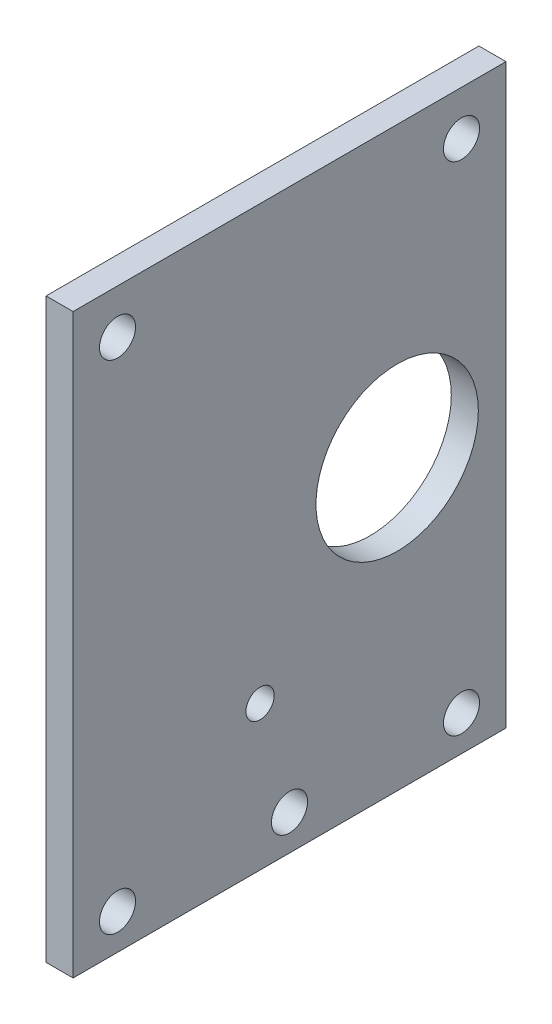
ISO-10303-21;
HEADER;
FILE_DESCRIPTION(('STEP AP214'),'2;1');
FILE_NAME('part.step','',(''),(''),'','','');
FILE_SCHEMA(('AUTOMOTIVE_DESIGN { 1 0 10303 214 1 1 1 1 }'));
ENDSEC;
DATA;
#1=APPLICATION_CONTEXT('core data for automotive mechanical design processes');
#2=APPLICATION_PROTOCOL_DEFINITION('international standard','automotive_design',2000,#1);
#3=PRODUCT_CONTEXT('',#1,'mechanical');
#4=PRODUCT('Part','Part','',(#3));
#5=PRODUCT_RELATED_PRODUCT_CATEGORY('part','',(#4));
#6=PRODUCT_DEFINITION_FORMATION('','',#4);
#7=PRODUCT_DEFINITION_CONTEXT('part definition',#1,'design');
#8=PRODUCT_DEFINITION('design','',#6,#7);
#9=PRODUCT_DEFINITION_SHAPE('','',#8);
#10=(LENGTH_UNIT() NAMED_UNIT(*) SI_UNIT(.MILLI.,.METRE.));
#11=(NAMED_UNIT(*) PLANE_ANGLE_UNIT() SI_UNIT($,.RADIAN.));
#12=(NAMED_UNIT(*) SI_UNIT($,.STERADIAN.) SOLID_ANGLE_UNIT());
#13=UNCERTAINTY_MEASURE_WITH_UNIT(LENGTH_MEASURE(1.E-05),#10,'distance_accuracy_value','');
#14=(GEOMETRIC_REPRESENTATION_CONTEXT(3) GLOBAL_UNCERTAINTY_ASSIGNED_CONTEXT((#13)) GLOBAL_UNIT_ASSIGNED_CONTEXT((#10,
#11,#12)) REPRESENTATION_CONTEXT('',''));
#15=CARTESIAN_POINT('',(0.,0.,0.));
#16=DIRECTION('',(0.,0.,1.));
#17=DIRECTION('',(1.,0.,0.));
#18=AXIS2_PLACEMENT_3D('',#15,#16,#17);
#19=CARTESIAN_POINT('',(4.7625,-50.8,-38.1));
#20=DIRECTION('',(0.,0.,1.));
#21=DIRECTION('',(1.,0.,0.));
#22=AXIS2_PLACEMENT_3D('',#19,#20,#21);
#23=PLANE('',#22);
#24=DIRECTION('',(0.,1.,0.));
#25=VECTOR('',#24,1.);
#26=CARTESIAN_POINT('',(0.,-50.8,-38.1));
#27=LINE('',#26,#25);
#28=CARTESIAN_POINT('',(0.,-50.8,-38.1));
#29=VERTEX_POINT('',#28);
#30=CARTESIAN_POINT('',(0.,50.8,-38.1));
#31=VERTEX_POINT('',#30);
#32=EDGE_CURVE('E99',#29,#31,#27,.T.);
#33=ORIENTED_EDGE('',*,*,#32,.T.);
#34=DIRECTION('',(-1.,0.,0.));
#35=VECTOR('',#34,1.);
#36=CARTESIAN_POINT('',(4.7625,50.8,-38.1));
#37=LINE('',#36,#35);
#38=CARTESIAN_POINT('',(4.7625,50.8,-38.1));
#39=VERTEX_POINT('',#38);
#40=EDGE_CURVE('E11',#39,#31,#37,.T.);
#41=ORIENTED_EDGE('',*,*,#40,.F.);
#42=DIRECTION('',(0.,1.,0.));
#43=VECTOR('',#42,1.);
#44=CARTESIAN_POINT('',(4.7625,-50.8,-38.1));
#45=LINE('',#44,#43);
#46=CARTESIAN_POINT('',(4.7625,-50.8,-38.1));
#47=VERTEX_POINT('',#46);
#48=EDGE_CURVE('E86',#47,#39,#45,.T.);
#49=ORIENTED_EDGE('',*,*,#48,.F.);
#50=DIRECTION('',(-1.,0.,0.));
#51=VECTOR('',#50,1.);
#52=CARTESIAN_POINT('',(4.7625,-50.8,-38.1));
#53=LINE('',#52,#51);
#54=EDGE_CURVE('E95',#47,#29,#53,.T.);
#55=ORIENTED_EDGE('',*,*,#54,.T.);
#56=EDGE_LOOP('',(#33,#41,#49,#55));
#57=FACE_BOUND('',#56,.T.);
#58=ADVANCED_FACE('F33',(#57),#23,.F.);
#59=CARTESIAN_POINT('',(4.7625,50.8,38.1));
#60=DIRECTION('',(0.,-1.,0.));
#61=DIRECTION('',(0.,0.,-1.));
#62=AXIS2_PLACEMENT_3D('',#59,#60,#61);
#63=PLANE('',#62);
#64=DIRECTION('',(0.,0.,1.));
#65=VECTOR('',#64,1.);
#66=CARTESIAN_POINT('',(0.,50.8,38.1));
#67=LINE('',#66,#65);
#68=CARTESIAN_POINT('',(0.,50.8,38.1));
#69=VERTEX_POINT('',#68);
#70=EDGE_CURVE('E90',#31,#69,#67,.T.);
#71=ORIENTED_EDGE('',*,*,#70,.T.);
#72=DIRECTION('',(-1.,0.,0.));
#73=VECTOR('',#72,1.);
#74=CARTESIAN_POINT('',(4.7625,50.8,38.1));
#75=LINE('',#74,#73);
#76=CARTESIAN_POINT('',(4.7625,50.8,38.1));
#77=VERTEX_POINT('',#76);
#78=EDGE_CURVE('E42',#77,#69,#75,.T.);
#79=ORIENTED_EDGE('',*,*,#78,.F.);
#80=DIRECTION('',(0.,0.,1.));
#81=VECTOR('',#80,1.);
#82=CARTESIAN_POINT('',(4.7625,50.8,38.1));
#83=LINE('',#82,#81);
#84=EDGE_CURVE('E81',#39,#77,#83,.T.);
#85=ORIENTED_EDGE('',*,*,#84,.F.);
#86=ORIENTED_EDGE('',*,*,#40,.T.);
#87=EDGE_LOOP('',(#71,#79,#85,#86));
#88=FACE_BOUND('',#87,.T.);
#89=ADVANCED_FACE('F89',(#88),#63,.F.);
#90=CARTESIAN_POINT('',(4.7625,-50.8,38.1));
#91=DIRECTION('',(0.,0.,-1.));
#92=DIRECTION('',(-1.,0.,0.));
#93=AXIS2_PLACEMENT_3D('',#90,#91,#92);
#94=PLANE('',#93);
#95=DIRECTION('',(0.,-1.,0.));
#96=VECTOR('',#95,1.);
#97=CARTESIAN_POINT('',(0.,-50.8,38.1));
#98=LINE('',#97,#96);
#99=CARTESIAN_POINT('',(0.,-50.8,38.1));
#100=VERTEX_POINT('',#99);
#101=EDGE_CURVE('E68',#69,#100,#98,.T.);
#102=ORIENTED_EDGE('',*,*,#101,.T.);
#103=DIRECTION('',(-1.,0.,0.));
#104=VECTOR('',#103,1.);
#105=CARTESIAN_POINT('',(4.7625,-50.8,38.1));
#106=LINE('',#105,#104);
#107=CARTESIAN_POINT('',(4.7625,-50.8,38.1));
#108=VERTEX_POINT('',#107);
#109=EDGE_CURVE('E91',#108,#100,#106,.T.);
#110=ORIENTED_EDGE('',*,*,#109,.F.);
#111=DIRECTION('',(0.,-1.,0.));
#112=VECTOR('',#111,1.);
#113=CARTESIAN_POINT('',(4.7625,-50.8,38.1));
#114=LINE('',#113,#112);
#115=EDGE_CURVE('E84',#77,#108,#114,.T.);
#116=ORIENTED_EDGE('',*,*,#115,.F.);
#117=ORIENTED_EDGE('',*,*,#78,.T.);
#118=EDGE_LOOP('',(#102,#110,#116,#117));
#119=FACE_BOUND('',#118,.T.);
#120=ADVANCED_FACE('F93',(#119),#94,.F.);
#121=CARTESIAN_POINT('',(4.7625,-50.8,38.1));
#122=DIRECTION('',(0.,1.,0.));
#123=DIRECTION('',(0.,0.,1.));
#124=AXIS2_PLACEMENT_3D('',#121,#122,#123);
#125=PLANE('',#124);
#126=DIRECTION('',(0.,0.,-1.));
#127=VECTOR('',#126,1.);
#128=CARTESIAN_POINT('',(0.,-50.8,38.1));
#129=LINE('',#128,#127);
#130=EDGE_CURVE('E74',#100,#29,#129,.T.);
#131=ORIENTED_EDGE('',*,*,#130,.T.);
#132=ORIENTED_EDGE('',*,*,#54,.F.);
#133=DIRECTION('',(0.,0.,-1.));
#134=VECTOR('',#133,1.);
#135=CARTESIAN_POINT('',(4.7625,-50.8,38.1));
#136=LINE('',#135,#134);
#137=EDGE_CURVE('E51',#108,#47,#136,.T.);
#138=ORIENTED_EDGE('',*,*,#137,.F.);
#139=ORIENTED_EDGE('',*,*,#109,.T.);
#140=EDGE_LOOP('',(#131,#132,#138,#139));
#141=FACE_BOUND('',#140,.T.);
#142=ADVANCED_FACE('F154',(#141),#125,.F.);
#143=CARTESIAN_POINT('',(4.7625,0.,0.));
#144=DIRECTION('',(-1.,0.,0.));
#145=DIRECTION('',(0.,0.,1.));
#146=AXIS2_PLACEMENT_3D('',#143,#144,#145);
#147=PLANE('',#146);
#148=CARTESIAN_POINT('',(4.7625,-44.5643,0.));
#149=DIRECTION('',(1.,0.,0.));
#150=DIRECTION('',(0.,0.,-1.));
#151=AXIS2_PLACEMENT_3D('',#148,#149,#150);
#152=CIRCLE('',#151,3.175);
#153=CARTESIAN_POINT('',(4.7625,-44.5643,-3.175));
#154=VERTEX_POINT('',#153);
#155=EDGE_CURVE('E138',#154,#154,#152,.T.);
#156=ORIENTED_EDGE('',*,*,#155,.F.);
#157=EDGE_LOOP('',(#156));
#158=FACE_BOUND('',#157,.T.);
#159=CARTESIAN_POINT('',(4.7625,-25.4,5.1816));
#160=DIRECTION('',(1.,0.,0.));
#161=DIRECTION('',(0.,0.,-1.));
#162=AXIS2_PLACEMENT_3D('',#159,#160,#161);
#163=CIRCLE('',#162,2.4892);
#164=CARTESIAN_POINT('',(4.7625,-25.4,2.6924));
#165=VERTEX_POINT('',#164);
#166=EDGE_CURVE('E128',#165,#165,#163,.T.);
#167=ORIENTED_EDGE('',*,*,#166,.F.);
#168=EDGE_LOOP('',(#167));
#169=FACE_BOUND('',#168,.T.);
#170=CARTESIAN_POINT('',(4.7625,0.,-18.9484));
#171=DIRECTION('',(1.,0.,0.));
#172=DIRECTION('',(0.,0.,-1.));
#173=AXIS2_PLACEMENT_3D('',#170,#171,#172);
#174=CIRCLE('',#173,14.2875);
#175=CARTESIAN_POINT('',(4.7625,0.,-33.2359));
#176=VERTEX_POINT('',#175);
#177=EDGE_CURVE('E125',#176,#176,#174,.T.);
#178=ORIENTED_EDGE('',*,*,#177,.F.);
#179=EDGE_LOOP('',(#178));
#180=FACE_BOUND('',#179,.T.);
#181=CARTESIAN_POINT('',(4.7625,-44.5643,30.2768));
#182=DIRECTION('',(1.,0.,0.));
#183=DIRECTION('',(0.,0.,-1.));
#184=AXIS2_PLACEMENT_3D('',#181,#182,#183);
#185=CIRCLE('',#184,3.175);
#186=CARTESIAN_POINT('',(4.7625,-44.5643,27.1018));
#187=VERTEX_POINT('',#186);
#188=EDGE_CURVE('E122',#187,#187,#185,.T.);
#189=ORIENTED_EDGE('',*,*,#188,.F.);
#190=EDGE_LOOP('',(#189));
#191=FACE_BOUND('',#190,.T.);
#192=CARTESIAN_POINT('',(4.7625,42.9768,30.2768));
#193=DIRECTION('',(1.,0.,0.));
#194=DIRECTION('',(0.,0.,-1.));
#195=AXIS2_PLACEMENT_3D('',#192,#193,#194);
#196=CIRCLE('',#195,3.175);
#197=CARTESIAN_POINT('',(4.7625,42.9768,27.1018));
#198=VERTEX_POINT('',#197);
#199=EDGE_CURVE('E118',#198,#198,#196,.T.);
#200=ORIENTED_EDGE('',*,*,#199,.F.);
#201=EDGE_LOOP('',(#200));
#202=FACE_BOUND('',#201,.T.);
#203=CARTESIAN_POINT('',(4.7625,-44.5643,-30.2768));
#204=DIRECTION('',(1.,0.,0.));
#205=DIRECTION('',(0.,0.,-1.));
#206=AXIS2_PLACEMENT_3D('',#203,#204,#205);
#207=CIRCLE('',#206,3.17499999999999);
#208=CARTESIAN_POINT('',(4.7625,-44.5643,-33.4518));
#209=VERTEX_POINT('',#208);
#210=EDGE_CURVE('E114',#209,#209,#207,.T.);
#211=ORIENTED_EDGE('',*,*,#210,.F.);
#212=EDGE_LOOP('',(#211));
#213=FACE_BOUND('',#212,.T.);
#214=CARTESIAN_POINT('',(4.7625,42.9768,-30.2768));
#215=DIRECTION('',(1.,0.,0.));
#216=DIRECTION('',(0.,0.,-1.));
#217=AXIS2_PLACEMENT_3D('',#214,#215,#216);
#218=CIRCLE('',#217,3.175);
#219=CARTESIAN_POINT('',(4.7625,42.9768,-33.4518));
#220=VERTEX_POINT('',#219);
#221=EDGE_CURVE('E110',#220,#220,#218,.T.);
#222=ORIENTED_EDGE('',*,*,#221,.F.);
#223=EDGE_LOOP('',(#222));
#224=FACE_BOUND('',#223,.T.);
#225=ORIENTED_EDGE('',*,*,#48,.T.);
#226=ORIENTED_EDGE('',*,*,#84,.T.);
#227=ORIENTED_EDGE('',*,*,#115,.T.);
#228=ORIENTED_EDGE('',*,*,#137,.T.);
#229=EDGE_LOOP('',(#225,#226,#227,#228));
#230=FACE_BOUND('',#229,.T.);
#231=ADVANCED_FACE('F82',(#158,#169,#180,#191,#202,#213,#224,#230),#147,.F.);
#232=CARTESIAN_POINT('',(0.,0.,0.));
#233=DIRECTION('',(-1.,0.,0.));
#234=DIRECTION('',(0.,0.,1.));
#235=AXIS2_PLACEMENT_3D('',#232,#233,#234);
#236=PLANE('',#235);
#237=CARTESIAN_POINT('',(0.,-44.5643,0.));
#238=DIRECTION('',(-1.,0.,0.));
#239=DIRECTION('',(0.,0.,1.));
#240=AXIS2_PLACEMENT_3D('',#237,#238,#239);
#241=CIRCLE('',#240,3.175);
#242=CARTESIAN_POINT('',(0.,-44.5643,3.175));
#243=VERTEX_POINT('',#242);
#244=EDGE_CURVE('E36',#243,#243,#241,.T.);
#245=ORIENTED_EDGE('',*,*,#244,.F.);
#246=EDGE_LOOP('',(#245));
#247=FACE_BOUND('',#246,.T.);
#248=CARTESIAN_POINT('',(0.,-25.4,5.1816));
#249=DIRECTION('',(-1.,0.,0.));
#250=DIRECTION('',(0.,0.,1.));
#251=AXIS2_PLACEMENT_3D('',#248,#249,#250);
#252=CIRCLE('',#251,2.4892);
#253=CARTESIAN_POINT('',(0.,-25.4,7.6708));
#254=VERTEX_POINT('',#253);
#255=EDGE_CURVE('E126',#254,#254,#252,.T.);
#256=ORIENTED_EDGE('',*,*,#255,.F.);
#257=EDGE_LOOP('',(#256));
#258=FACE_BOUND('',#257,.T.);
#259=CARTESIAN_POINT('',(0.,0.,-18.9484));
#260=DIRECTION('',(-1.,0.,0.));
#261=DIRECTION('',(0.,0.,1.));
#262=AXIS2_PLACEMENT_3D('',#259,#260,#261);
#263=CIRCLE('',#262,14.2875);
#264=CARTESIAN_POINT('',(0.,0.,-4.66089999999999));
#265=VERTEX_POINT('',#264);
#266=EDGE_CURVE('E123',#265,#265,#263,.T.);
#267=ORIENTED_EDGE('',*,*,#266,.F.);
#268=EDGE_LOOP('',(#267));
#269=FACE_BOUND('',#268,.T.);
#270=CARTESIAN_POINT('',(0.,-44.5643,30.2768));
#271=DIRECTION('',(-1.,0.,0.));
#272=DIRECTION('',(0.,0.,1.));
#273=AXIS2_PLACEMENT_3D('',#270,#271,#272);
#274=CIRCLE('',#273,3.175);
#275=CARTESIAN_POINT('',(0.,-44.5643,33.4518));
#276=VERTEX_POINT('',#275);
#277=EDGE_CURVE('E119',#276,#276,#274,.T.);
#278=ORIENTED_EDGE('',*,*,#277,.F.);
#279=EDGE_LOOP('',(#278));
#280=FACE_BOUND('',#279,.T.);
#281=CARTESIAN_POINT('',(0.,42.9768,30.2768));
#282=DIRECTION('',(-1.,0.,0.));
#283=DIRECTION('',(0.,0.,1.));
#284=AXIS2_PLACEMENT_3D('',#281,#282,#283);
#285=CIRCLE('',#284,3.175);
#286=CARTESIAN_POINT('',(0.,42.9768,33.4518));
#287=VERTEX_POINT('',#286);
#288=EDGE_CURVE('E115',#287,#287,#285,.T.);
#289=ORIENTED_EDGE('',*,*,#288,.F.);
#290=EDGE_LOOP('',(#289));
#291=FACE_BOUND('',#290,.T.);
#292=CARTESIAN_POINT('',(0.,-44.5643,-30.2768));
#293=DIRECTION('',(-1.,0.,0.));
#294=DIRECTION('',(0.,0.,1.));
#295=AXIS2_PLACEMENT_3D('',#292,#293,#294);
#296=CIRCLE('',#295,3.17499999999999);
#297=CARTESIAN_POINT('',(0.,-44.5643,-27.1018));
#298=VERTEX_POINT('',#297);
#299=EDGE_CURVE('E111',#298,#298,#296,.T.);
#300=ORIENTED_EDGE('',*,*,#299,.F.);
#301=EDGE_LOOP('',(#300));
#302=FACE_BOUND('',#301,.T.);
#303=CARTESIAN_POINT('',(0.,42.9768,-30.2768));
#304=DIRECTION('',(-1.,0.,0.));
#305=DIRECTION('',(0.,0.,1.));
#306=AXIS2_PLACEMENT_3D('',#303,#304,#305);
#307=CIRCLE('',#306,3.175);
#308=CARTESIAN_POINT('',(0.,42.9768,-27.1018));
#309=VERTEX_POINT('',#308);
#310=EDGE_CURVE('E102',#309,#309,#307,.T.);
#311=ORIENTED_EDGE('',*,*,#310,.F.);
#312=EDGE_LOOP('',(#311));
#313=FACE_BOUND('',#312,.T.);
#314=ORIENTED_EDGE('',*,*,#32,.F.);
#315=ORIENTED_EDGE('',*,*,#130,.F.);
#316=ORIENTED_EDGE('',*,*,#101,.F.);
#317=ORIENTED_EDGE('',*,*,#70,.F.);
#318=EDGE_LOOP('',(#314,#315,#316,#317));
#319=FACE_BOUND('',#318,.T.);
#320=ADVANCED_FACE('F153',(#247,#258,#269,#280,#291,#302,#313,#319),#236,.T.);
#321=CARTESIAN_POINT('',(-1.5875,42.9768,-30.2768));
#322=DIRECTION('',(1.,0.,0.));
#323=DIRECTION('',(0.,0.,-1.));
#324=AXIS2_PLACEMENT_3D('',#321,#322,#323);
#325=CYLINDRICAL_SURFACE('',#324,3.175);
#326=ORIENTED_EDGE('',*,*,#310,.T.);
#327=EDGE_LOOP('',(#326));
#328=FACE_BOUND('',#327,.T.);
#329=ORIENTED_EDGE('',*,*,#221,.T.);
#330=EDGE_LOOP('',(#329));
#331=FACE_BOUND('',#330,.T.);
#332=ADVANCED_FACE('F150',(#328,#331),#325,.F.);
#333=CARTESIAN_POINT('',(-1.5875,-44.5643,-30.2768));
#334=DIRECTION('',(1.,0.,0.));
#335=DIRECTION('',(0.,0.,-1.));
#336=AXIS2_PLACEMENT_3D('',#333,#334,#335);
#337=CYLINDRICAL_SURFACE('',#336,3.17499999999999);
#338=ORIENTED_EDGE('',*,*,#299,.T.);
#339=EDGE_LOOP('',(#338));
#340=FACE_BOUND('',#339,.T.);
#341=ORIENTED_EDGE('',*,*,#210,.T.);
#342=EDGE_LOOP('',(#341));
#343=FACE_BOUND('',#342,.T.);
#344=ADVANCED_FACE('F193',(#340,#343),#337,.F.);
#345=CARTESIAN_POINT('',(-1.5875,42.9768,30.2768));
#346=DIRECTION('',(1.,0.,0.));
#347=DIRECTION('',(0.,0.,-1.));
#348=AXIS2_PLACEMENT_3D('',#345,#346,#347);
#349=CYLINDRICAL_SURFACE('',#348,3.175);
#350=ORIENTED_EDGE('',*,*,#288,.T.);
#351=EDGE_LOOP('',(#350));
#352=FACE_BOUND('',#351,.T.);
#353=ORIENTED_EDGE('',*,*,#199,.T.);
#354=EDGE_LOOP('',(#353));
#355=FACE_BOUND('',#354,.T.);
#356=ADVANCED_FACE('F212',(#352,#355),#349,.F.);
#357=CARTESIAN_POINT('',(-1.5875,-44.5643,30.2768));
#358=DIRECTION('',(1.,0.,0.));
#359=DIRECTION('',(0.,0.,-1.));
#360=AXIS2_PLACEMENT_3D('',#357,#358,#359);
#361=CYLINDRICAL_SURFACE('',#360,3.175);
#362=ORIENTED_EDGE('',*,*,#277,.T.);
#363=EDGE_LOOP('',(#362));
#364=FACE_BOUND('',#363,.T.);
#365=ORIENTED_EDGE('',*,*,#188,.T.);
#366=EDGE_LOOP('',(#365));
#367=FACE_BOUND('',#366,.T.);
#368=ADVANCED_FACE('F222',(#364,#367),#361,.F.);
#369=CARTESIAN_POINT('',(-1.5875,0.,-18.9484));
#370=DIRECTION('',(1.,0.,0.));
#371=DIRECTION('',(0.,0.,-1.));
#372=AXIS2_PLACEMENT_3D('',#369,#370,#371);
#373=CYLINDRICAL_SURFACE('',#372,14.2875);
#374=ORIENTED_EDGE('',*,*,#266,.T.);
#375=EDGE_LOOP('',(#374));
#376=FACE_BOUND('',#375,.T.);
#377=ORIENTED_EDGE('',*,*,#177,.T.);
#378=EDGE_LOOP('',(#377));
#379=FACE_BOUND('',#378,.T.);
#380=ADVANCED_FACE('F232',(#376,#379),#373,.F.);
#381=CARTESIAN_POINT('',(-1.5875,-25.4,5.1816));
#382=DIRECTION('',(1.,0.,0.));
#383=DIRECTION('',(0.,0.,-1.));
#384=AXIS2_PLACEMENT_3D('',#381,#382,#383);
#385=CYLINDRICAL_SURFACE('',#384,2.4892);
#386=ORIENTED_EDGE('',*,*,#255,.T.);
#387=EDGE_LOOP('',(#386));
#388=FACE_BOUND('',#387,.T.);
#389=ORIENTED_EDGE('',*,*,#166,.T.);
#390=EDGE_LOOP('',(#389));
#391=FACE_BOUND('',#390,.T.);
#392=ADVANCED_FACE('F242',(#388,#391),#385,.F.);
#393=CARTESIAN_POINT('',(-1.5875,-44.5643,0.));
#394=DIRECTION('',(1.,0.,0.));
#395=DIRECTION('',(0.,0.,-1.));
#396=AXIS2_PLACEMENT_3D('',#393,#394,#395);
#397=CYLINDRICAL_SURFACE('',#396,3.175);
#398=ORIENTED_EDGE('',*,*,#244,.T.);
#399=EDGE_LOOP('',(#398));
#400=FACE_BOUND('',#399,.T.);
#401=ORIENTED_EDGE('',*,*,#155,.T.);
#402=EDGE_LOOP('',(#401));
#403=FACE_BOUND('',#402,.T.);
#404=ADVANCED_FACE('F252',(#400,#403),#397,.F.);
#405=CLOSED_SHELL('',(#58,#89,#120,#142,#231,#320,#332,#344,#356,#368,#380,#392,#404));
#406=MANIFOLD_SOLID_BREP('B2',#405);
#407=ADVANCED_BREP_SHAPE_REPRESENTATION('',(#18,#406),#14);
#408=SHAPE_DEFINITION_REPRESENTATION(#9,#407);
ENDSEC;
END-ISO-10303-21;
